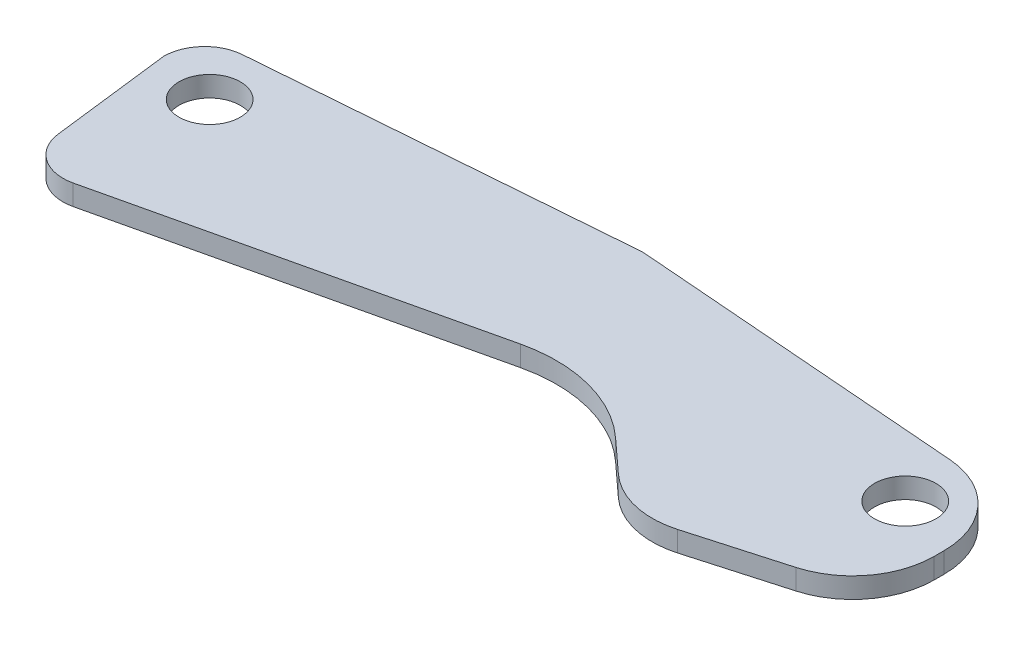
ISO-10303-21;
HEADER;
FILE_DESCRIPTION(('STEP AP214'),'2;1');
FILE_NAME('part.step','',(''),(''),'','','');
FILE_SCHEMA(('AUTOMOTIVE_DESIGN { 1 0 10303 214 1 1 1 1 }'));
ENDSEC;
DATA;
#1=APPLICATION_CONTEXT('core data for automotive mechanical design processes');
#2=APPLICATION_PROTOCOL_DEFINITION('international standard','automotive_design',2000,#1);
#3=PRODUCT_CONTEXT('',#1,'mechanical');
#4=PRODUCT('Part','Part','',(#3));
#5=PRODUCT_RELATED_PRODUCT_CATEGORY('part','',(#4));
#6=PRODUCT_DEFINITION_FORMATION('','',#4);
#7=PRODUCT_DEFINITION_CONTEXT('part definition',#1,'design');
#8=PRODUCT_DEFINITION('design','',#6,#7);
#9=PRODUCT_DEFINITION_SHAPE('','',#8);
#10=(LENGTH_UNIT() NAMED_UNIT(*) SI_UNIT(.MILLI.,.METRE.));
#11=(NAMED_UNIT(*) PLANE_ANGLE_UNIT() SI_UNIT($,.RADIAN.));
#12=(NAMED_UNIT(*) SI_UNIT($,.STERADIAN.) SOLID_ANGLE_UNIT());
#13=UNCERTAINTY_MEASURE_WITH_UNIT(LENGTH_MEASURE(1.E-05),#10,'distance_accuracy_value','');
#14=(GEOMETRIC_REPRESENTATION_CONTEXT(3) GLOBAL_UNCERTAINTY_ASSIGNED_CONTEXT((#13)) GLOBAL_UNIT_ASSIGNED_CONTEXT((#10,
#11,#12)) REPRESENTATION_CONTEXT('',''));
#15=CARTESIAN_POINT('',(0.,0.,0.));
#16=DIRECTION('',(0.,0.,1.));
#17=DIRECTION('',(1.,0.,0.));
#18=AXIS2_PLACEMENT_3D('',#15,#16,#17);
#19=CARTESIAN_POINT('',(0.,1.,0.));
#20=DIRECTION('',(0.,-1.,0.));
#21=DIRECTION('',(0.,0.,-1.));
#22=AXIS2_PLACEMENT_3D('',#19,#20,#21);
#23=PLANE('',#22);
#24=CARTESIAN_POINT('',(-17.04840786739,1.,-1.62405430046112));
#25=DIRECTION('',(0.,1.,0.));
#26=DIRECTION('',(0.,0.,1.));
#27=AXIS2_PLACEMENT_3D('',#24,#25,#26);
#28=CIRCLE('',#27,1.5);
#29=CARTESIAN_POINT('',(-17.04840786739,1.,-0.124054300461121));
#30=VERTEX_POINT('',#29);
#31=EDGE_CURVE('E247',#30,#30,#28,.T.);
#32=ORIENTED_EDGE('',*,*,#31,.F.);
#33=EDGE_LOOP('',(#32));
#34=FACE_BOUND('',#33,.T.);
#35=CARTESIAN_POINT('',(16.95159213261,1.,-1.62405430046112));
#36=DIRECTION('',(0.,1.,0.));
#37=DIRECTION('',(0.,0.,1.));
#38=AXIS2_PLACEMENT_3D('',#35,#36,#37);
#39=CIRCLE('',#38,1.50145326416188);
#40=CARTESIAN_POINT('',(16.95159213261,1.,-0.122601036299243));
#41=VERTEX_POINT('',#40);
#42=EDGE_CURVE('E489',#41,#41,#39,.T.);
#43=ORIENTED_EDGE('',*,*,#42,.F.);
#44=EDGE_LOOP('',(#43));
#45=FACE_BOUND('',#44,.T.);
#46=DIRECTION('',(0.961653618203562,0.,-0.274266874769809));
#47=VECTOR('',#46,1.);
#48=CARTESIAN_POINT('',(2.30223376436049,1.,8.07225236844889));
#49=LINE('',#48,#47);
#50=CARTESIAN_POINT('',(12.5934378050347,1.,5.13716605834188));
#51=VERTEX_POINT('',#50);
#52=CARTESIAN_POINT('',(17.0970674990792,1.,3.85271558893738));
#53=VERTEX_POINT('',#52);
#54=EDGE_CURVE('E235',#51,#53,#49,.T.);
#55=ORIENTED_EDGE('',*,*,#54,.T.);
#56=CARTESIAN_POINT('',(16.,1.,0.00610111612312902));
#57=DIRECTION('',(0.,-1.,0.));
#58=DIRECTION('',(0.,0.,-1.));
#59=AXIS2_PLACEMENT_3D('',#56,#57,#58);
#60=CIRCLE('',#59,4.);
#61=CARTESIAN_POINT('',(20.,1.,0.00610111612312902));
#62=VERTEX_POINT('',#61);
#63=EDGE_CURVE('E95',#53,#62,#60,.F.);
#64=ORIENTED_EDGE('',*,*,#63,.T.);
#65=DIRECTION('',(0.,0.,-1.));
#66=VECTOR('',#65,1.);
#67=CARTESIAN_POINT('',(20.,1.,5.75));
#68=LINE('',#67,#66);
#69=CARTESIAN_POINT('',(20.,1.,-0.479957640630012));
#70=VERTEX_POINT('',#69);
#71=EDGE_CURVE('E273',#62,#70,#68,.T.);
#72=ORIENTED_EDGE('',*,*,#71,.T.);
#73=CARTESIAN_POINT('',(16.,1.,-0.479957640630012));
#74=DIRECTION('',(0.,-1.,0.));
#75=DIRECTION('',(0.,0.,-1.));
#76=AXIS2_PLACEMENT_3D('',#73,#74,#75);
#77=CIRCLE('',#76,4.);
#78=CARTESIAN_POINT('',(16.313458923201,1.,-4.46765666431092));
#79=VERTEX_POINT('',#78);
#80=EDGE_CURVE('E288',#70,#79,#77,.F.);
#81=ORIENTED_EDGE('',*,*,#80,.T.);
#82=DIRECTION('',(0.996924755920226,0.,0.0783647308002611));
#83=VECTOR('',#82,1.);
#84=CARTESIAN_POINT('',(0.449211505723376,1.,-5.71468907155796));
#85=LINE('',#84,#83);
#86=CARTESIAN_POINT('',(0.156729461600511,1.,-5.73768005108323));
#87=VERTEX_POINT('',#86);
#88=EDGE_CURVE('E184',#87,#79,#85,.T.);
#89=ORIENTED_EDGE('',*,*,#88,.F.);
#90=CARTESIAN_POINT('',(0.,1.,-3.74383053924278));
#91=DIRECTION('',(0.,-1.,0.));
#92=DIRECTION('',(0.,0.,-1.));
#93=AXIS2_PLACEMENT_3D('',#90,#91,#92);
#94=CIRCLE('',#93,2.);
#95=CARTESIAN_POINT('',(-0.156729461600533,1.,-5.73768005108323));
#96=VERTEX_POINT('',#95);
#97=EDGE_CURVE('E279',#87,#96,#94,.F.);
#98=ORIENTED_EDGE('',*,*,#97,.T.);
#99=DIRECTION('',(-0.996924755920226,0.,0.0783647308002611));
#100=VECTOR('',#99,1.);
#101=CARTESIAN_POINT('',(-0.449211505723376,1.,-5.71468907155797));
#102=LINE('',#101,#100);
#103=CARTESIAN_POINT('',(-18.1567294616005,1.,-4.32276368349574));
#104=VERTEX_POINT('',#103);
#105=EDGE_CURVE('E265',#96,#104,#102,.T.);
#106=ORIENTED_EDGE('',*,*,#105,.T.);
#107=CARTESIAN_POINT('',(-18.,1.,-2.32891417165529));
#108=DIRECTION('',(0.,-1.,0.));
#109=DIRECTION('',(0.,0.,-1.));
#110=AXIS2_PLACEMENT_3D('',#107,#108,#109);
#111=CIRCLE('',#110,2.);
#112=CARTESIAN_POINT('',(-20.,1.,-2.32891417165529));
#113=VERTEX_POINT('',#112);
#114=EDGE_CURVE('E193',#104,#113,#111,.F.);
#115=ORIENTED_EDGE('',*,*,#114,.T.);
#116=DIRECTION('',(-0.120898963634585,0.,-0.992664817847436));
#117=VECTOR('',#116,1.);
#118=CARTESIAN_POINT('',(-20.,1.,-2.32891417165527));
#119=LINE('',#118,#117);
#120=CARTESIAN_POINT('',(-19.2851215731203,1.,3.5407363370657));
#121=VERTEX_POINT('',#120);
#122=EDGE_CURVE('E185',#121,#113,#119,.T.);
#123=ORIENTED_EDGE('',*,*,#122,.F.);
#124=CARTESIAN_POINT('',(-17.2997919374255,1.,3.29893840979653));
#125=DIRECTION('',(0.,-1.,0.));
#126=DIRECTION('',(0.,0.,-1.));
#127=AXIS2_PLACEMENT_3D('',#124,#125,#126);
#128=CIRCLE('',#127,2.);
#129=CARTESIAN_POINT('',(-16.8479918287672,1.,5.24723937777257));
#130=VERTEX_POINT('',#129);
#131=EDGE_CURVE('E201',#121,#130,#128,.F.);
#132=ORIENTED_EDGE('',*,*,#131,.T.);
#133=DIRECTION('',(0.974150483988019,0.,-0.225900054329141));
#134=VECTOR('',#133,1.);
#135=CARTESIAN_POINT('',(0.294943810343831,1.,1.27188838643253));
#136=LINE('',#135,#134);
#137=CARTESIAN_POINT('',(0.89910877577796,1.,1.13178590662202));
#138=VERTEX_POINT('',#137);
#139=EDGE_CURVE('E255',#130,#138,#136,.T.);
#140=ORIENTED_EDGE('',*,*,#139,.T.);
#141=CARTESIAN_POINT('',(2.48040915608195,1.,7.95083929453815));
#142=DIRECTION('',(0.,-1.,0.));
#143=DIRECTION('',(0.,0.,-1.));
#144=AXIS2_PLACEMENT_3D('',#141,#142,#143);
#145=CIRCLE('',#144,7.);
#146=CARTESIAN_POINT('',(7.20576337652104,1.,2.78643928181853));
#147=VERTEX_POINT('',#146);
#148=EDGE_CURVE('E214',#138,#147,#145,.T.);
#149=ORIENTED_EDGE('',*,*,#148,.T.);
#150=DIRECTION('',(0.737771430388518,0.,0.67505060291987));
#151=VECTOR('',#150,1.);
#152=CARTESIAN_POINT('',(1.89587935987788,1.,-2.07203077981282));
#153=LINE('',#152,#151);
#154=CARTESIAN_POINT('',(8.79616789427599,1.,4.2416373070817));
#155=VERTEX_POINT('',#154);
#156=EDGE_CURVE('E244',#147,#155,#153,.T.);
#157=ORIENTED_EDGE('',*,*,#156,.T.);
#158=CARTESIAN_POINT('',(11.4963703059555,1.,1.29055158552763));
#159=DIRECTION('',(0.,-1.,0.));
#160=DIRECTION('',(0.,0.,-1.));
#161=AXIS2_PLACEMENT_3D('',#158,#159,#160);
#162=CIRCLE('',#161,4.);
#163=EDGE_CURVE('E221',#155,#51,#162,.F.);
#164=ORIENTED_EDGE('',*,*,#163,.T.);
#165=EDGE_LOOP('',(#55,#64,#72,#81,#89,#98,#106,#115,#123,#132,#140,#149,#157,#164));
#166=FACE_BOUND('',#165,.T.);
#167=ADVANCED_FACE('F73',(#34,#45,#166),#23,.F.);
#168=CARTESIAN_POINT('',(0.,0.,0.));
#169=DIRECTION('',(0.,-1.,0.));
#170=DIRECTION('',(0.,0.,-1.));
#171=AXIS2_PLACEMENT_3D('',#168,#169,#170);
#172=PLANE('',#171);
#173=CARTESIAN_POINT('',(-17.04840786739,0.,-1.62405430046112));
#174=DIRECTION('',(0.,1.,0.));
#175=DIRECTION('',(0.,0.,1.));
#176=AXIS2_PLACEMENT_3D('',#173,#174,#175);
#177=CIRCLE('',#176,1.5);
#178=CARTESIAN_POINT('',(-17.04840786739,0.,-0.124054300461121));
#179=VERTEX_POINT('',#178);
#180=EDGE_CURVE('E242',#179,#179,#177,.T.);
#181=ORIENTED_EDGE('',*,*,#180,.T.);
#182=EDGE_LOOP('',(#181));
#183=FACE_BOUND('',#182,.T.);
#184=CARTESIAN_POINT('',(16.95159213261,0.,-1.62405430046112));
#185=DIRECTION('',(0.,1.,0.));
#186=DIRECTION('',(0.,0.,1.));
#187=AXIS2_PLACEMENT_3D('',#184,#185,#186);
#188=CIRCLE('',#187,1.50145326416188);
#189=CARTESIAN_POINT('',(16.95159213261,0.,-0.122601036299243));
#190=VERTEX_POINT('',#189);
#191=EDGE_CURVE('E486',#190,#190,#188,.T.);
#192=ORIENTED_EDGE('',*,*,#191,.T.);
#193=EDGE_LOOP('',(#192));
#194=FACE_BOUND('',#193,.T.);
#195=DIRECTION('',(0.,0.,-1.));
#196=VECTOR('',#195,1.);
#197=CARTESIAN_POINT('',(20.,0.,5.75));
#198=LINE('',#197,#196);
#199=CARTESIAN_POINT('',(20.,0.,0.00610111612312902));
#200=VERTEX_POINT('',#199);
#201=CARTESIAN_POINT('',(20.,0.,-0.479957640630012));
#202=VERTEX_POINT('',#201);
#203=EDGE_CURVE('E270',#200,#202,#198,.T.);
#204=ORIENTED_EDGE('',*,*,#203,.F.);
#205=CARTESIAN_POINT('',(16.,0.,0.00610111612312902));
#206=DIRECTION('',(0.,-1.,0.));
#207=DIRECTION('',(0.,0.,-1.));
#208=AXIS2_PLACEMENT_3D('',#205,#206,#207);
#209=CIRCLE('',#208,4.);
#210=CARTESIAN_POINT('',(17.0970674990792,0.,3.85271558893738));
#211=VERTEX_POINT('',#210);
#212=EDGE_CURVE('E12',#200,#211,#209,.T.);
#213=ORIENTED_EDGE('',*,*,#212,.T.);
#214=DIRECTION('',(0.961653618203562,0.,-0.274266874769809));
#215=VECTOR('',#214,1.);
#216=CARTESIAN_POINT('',(2.30223376436049,0.,8.07225236844889));
#217=LINE('',#216,#215);
#218=CARTESIAN_POINT('',(12.5934378050347,0.,5.13716605834188));
#219=VERTEX_POINT('',#218);
#220=EDGE_CURVE('E238',#219,#211,#217,.T.);
#221=ORIENTED_EDGE('',*,*,#220,.F.);
#222=CARTESIAN_POINT('',(11.4963703059555,0.,1.29055158552763));
#223=DIRECTION('',(0.,-1.,0.));
#224=DIRECTION('',(0.,0.,-1.));
#225=AXIS2_PLACEMENT_3D('',#222,#223,#224);
#226=CIRCLE('',#225,4.);
#227=CARTESIAN_POINT('',(8.79616789427599,0.,4.2416373070817));
#228=VERTEX_POINT('',#227);
#229=EDGE_CURVE('E225',#219,#228,#226,.T.);
#230=ORIENTED_EDGE('',*,*,#229,.T.);
#231=DIRECTION('',(0.737771430388518,0.,0.67505060291987));
#232=VECTOR('',#231,1.);
#233=CARTESIAN_POINT('',(1.89587935987788,0.,-2.07203077981282));
#234=LINE('',#233,#232);
#235=CARTESIAN_POINT('',(7.20576337652104,0.,2.78643928181853));
#236=VERTEX_POINT('',#235);
#237=EDGE_CURVE('E251',#236,#228,#234,.T.);
#238=ORIENTED_EDGE('',*,*,#237,.F.);
#239=CARTESIAN_POINT('',(2.48040915608195,0.,7.95083929453815));
#240=DIRECTION('',(0.,-1.,0.));
#241=DIRECTION('',(0.,0.,-1.));
#242=AXIS2_PLACEMENT_3D('',#239,#240,#241);
#243=CIRCLE('',#242,7.);
#244=CARTESIAN_POINT('',(0.89910877577796,0.,1.13178590662202));
#245=VERTEX_POINT('',#244);
#246=EDGE_CURVE('E216',#236,#245,#243,.F.);
#247=ORIENTED_EDGE('',*,*,#246,.T.);
#248=DIRECTION('',(0.974150483988019,0.,-0.225900054329141));
#249=VECTOR('',#248,1.);
#250=CARTESIAN_POINT('',(0.294943810343831,0.,1.27188838643253));
#251=LINE('',#250,#249);
#252=CARTESIAN_POINT('',(-16.8479918287672,0.,5.24723937777257));
#253=VERTEX_POINT('',#252);
#254=EDGE_CURVE('E254',#253,#245,#251,.T.);
#255=ORIENTED_EDGE('',*,*,#254,.F.);
#256=CARTESIAN_POINT('',(-17.2997919374255,0.,3.29893840979653));
#257=DIRECTION('',(0.,-1.,0.));
#258=DIRECTION('',(0.,0.,-1.));
#259=AXIS2_PLACEMENT_3D('',#256,#257,#258);
#260=CIRCLE('',#259,2.);
#261=CARTESIAN_POINT('',(-19.2851215731203,0.,3.5407363370657));
#262=VERTEX_POINT('',#261);
#263=EDGE_CURVE('E180',#253,#262,#260,.T.);
#264=ORIENTED_EDGE('',*,*,#263,.T.);
#265=DIRECTION('',(-0.120898963634585,0.,-0.992664817847436));
#266=VECTOR('',#265,1.);
#267=CARTESIAN_POINT('',(-20.,0.,-2.32891417165527));
#268=LINE('',#267,#266);
#269=CARTESIAN_POINT('',(-20.,0.,-2.32891417165527));
#270=VERTEX_POINT('',#269);
#271=EDGE_CURVE('E171',#262,#270,#268,.T.);
#272=ORIENTED_EDGE('',*,*,#271,.T.);
#273=CARTESIAN_POINT('',(-18.,0.,-2.32891417165529));
#274=DIRECTION('',(0.,-1.,0.));
#275=DIRECTION('',(0.,0.,-1.));
#276=AXIS2_PLACEMENT_3D('',#273,#274,#275);
#277=CIRCLE('',#276,2.);
#278=CARTESIAN_POINT('',(-18.1567294616005,0.,-4.32276368349574));
#279=VERTEX_POINT('',#278);
#280=EDGE_CURVE('E176',#270,#279,#277,.T.);
#281=ORIENTED_EDGE('',*,*,#280,.T.);
#282=DIRECTION('',(-0.996924755920226,0.,0.0783647308002611));
#283=VECTOR('',#282,1.);
#284=CARTESIAN_POINT('',(-0.449211505723376,0.,-5.71468907155797));
#285=LINE('',#284,#283);
#286=CARTESIAN_POINT('',(-0.156729461600533,0.,-5.73768005108323));
#287=VERTEX_POINT('',#286);
#288=EDGE_CURVE('E268',#287,#279,#285,.T.);
#289=ORIENTED_EDGE('',*,*,#288,.F.);
#290=CARTESIAN_POINT('',(0.,0.,-3.74383053924278));
#291=DIRECTION('',(0.,-1.,0.));
#292=DIRECTION('',(0.,0.,-1.));
#293=AXIS2_PLACEMENT_3D('',#290,#291,#292);
#294=CIRCLE('',#293,2.);
#295=CARTESIAN_POINT('',(0.156729461600511,0.,-5.73768005108323));
#296=VERTEX_POINT('',#295);
#297=EDGE_CURVE('E283',#287,#296,#294,.T.);
#298=ORIENTED_EDGE('',*,*,#297,.T.);
#299=DIRECTION('',(0.996924755920226,0.,0.0783647308002611));
#300=VECTOR('',#299,1.);
#301=CARTESIAN_POINT('',(0.449211505723376,0.,-5.71468907155796));
#302=LINE('',#301,#300);
#303=CARTESIAN_POINT('',(16.313458923201,0.,-4.46765666431092));
#304=VERTEX_POINT('',#303);
#305=EDGE_CURVE('E262',#296,#304,#302,.T.);
#306=ORIENTED_EDGE('',*,*,#305,.T.);
#307=CARTESIAN_POINT('',(16.,0.,-0.479957640630012));
#308=DIRECTION('',(0.,-1.,0.));
#309=DIRECTION('',(0.,0.,-1.));
#310=AXIS2_PLACEMENT_3D('',#307,#308,#309);
#311=CIRCLE('',#310,4.);
#312=EDGE_CURVE('E292',#304,#202,#311,.T.);
#313=ORIENTED_EDGE('',*,*,#312,.T.);
#314=EDGE_LOOP('',(#204,#213,#221,#230,#238,#247,#255,#264,#272,#281,#289,#298,#306,#313));
#315=FACE_BOUND('',#314,.T.);
#316=ADVANCED_FACE('F173',(#183,#194,#315),#172,.T.);
#317=CARTESIAN_POINT('',(20.,1.,5.75));
#318=DIRECTION('',(-1.,0.,0.));
#319=DIRECTION('',(0.,0.,1.));
#320=AXIS2_PLACEMENT_3D('',#317,#318,#319);
#321=PLANE('',#320);
#322=ORIENTED_EDGE('',*,*,#71,.F.);
#323=DIRECTION('',(0.,1.,0.));
#324=VECTOR('',#323,1.);
#325=CARTESIAN_POINT('',(20.,0.,0.00610111612312902));
#326=LINE('',#325,#324);
#327=EDGE_CURVE('E81',#62,#200,#326,.F.);
#328=ORIENTED_EDGE('',*,*,#327,.T.);
#329=ORIENTED_EDGE('',*,*,#203,.T.);
#330=DIRECTION('',(0.,1.,0.));
#331=VECTOR('',#330,1.);
#332=CARTESIAN_POINT('',(20.,1.,-0.479957640630012));
#333=LINE('',#332,#331);
#334=EDGE_CURVE('E285',#202,#70,#333,.T.);
#335=ORIENTED_EDGE('',*,*,#334,.T.);
#336=EDGE_LOOP('',(#322,#328,#329,#335));
#337=FACE_BOUND('',#336,.T.);
#338=ADVANCED_FACE('F313',(#337),#321,.F.);
#339=CARTESIAN_POINT('',(-0.449211505723376,0.,-5.71468907155797));
#340=DIRECTION('',(-0.0783647308002611,0.,-0.996924755920226));
#341=DIRECTION('',(-0.996924755920226,0.,0.0783647308002611));
#342=AXIS2_PLACEMENT_3D('',#339,#340,#341);
#343=PLANE('',#342);
#344=ORIENTED_EDGE('',*,*,#288,.T.);
#345=DIRECTION('',(0.,1.,0.));
#346=VECTOR('',#345,1.);
#347=CARTESIAN_POINT('',(-18.1567294616005,1.,-4.32276368349574));
#348=LINE('',#347,#346);
#349=EDGE_CURVE('E198',#279,#104,#348,.T.);
#350=ORIENTED_EDGE('',*,*,#349,.T.);
#351=ORIENTED_EDGE('',*,*,#105,.F.);
#352=DIRECTION('',(0.,1.,0.));
#353=VECTOR('',#352,1.);
#354=CARTESIAN_POINT('',(-0.156729461600533,0.,-5.73768005108323));
#355=LINE('',#354,#353);
#356=EDGE_CURVE('E281',#96,#287,#355,.F.);
#357=ORIENTED_EDGE('',*,*,#356,.T.);
#358=EDGE_LOOP('',(#344,#350,#351,#357));
#359=FACE_BOUND('',#358,.T.);
#360=ADVANCED_FACE('F297',(#359),#343,.T.);
#361=CARTESIAN_POINT('',(0.449211505723376,0.,-5.71468907155796));
#362=DIRECTION('',(-0.0783647308002611,0.,0.996924755920226));
#363=DIRECTION('',(0.996924755920226,0.,0.0783647308002611));
#364=AXIS2_PLACEMENT_3D('',#361,#362,#363);
#365=PLANE('',#364);
#366=ORIENTED_EDGE('',*,*,#88,.T.);
#367=DIRECTION('',(0.,1.,0.));
#368=VECTOR('',#367,1.);
#369=CARTESIAN_POINT('',(16.313458923201,0.,-4.46765666431092));
#370=LINE('',#369,#368);
#371=EDGE_CURVE('E290',#79,#304,#370,.F.);
#372=ORIENTED_EDGE('',*,*,#371,.T.);
#373=ORIENTED_EDGE('',*,*,#305,.F.);
#374=DIRECTION('',(0.,1.,0.));
#375=VECTOR('',#374,1.);
#376=CARTESIAN_POINT('',(0.156729461600511,1.,-5.73768005108323));
#377=LINE('',#376,#375);
#378=EDGE_CURVE('E275',#296,#87,#377,.T.);
#379=ORIENTED_EDGE('',*,*,#378,.T.);
#380=EDGE_LOOP('',(#366,#372,#373,#379));
#381=FACE_BOUND('',#380,.T.);
#382=ADVANCED_FACE('F306',(#381),#365,.F.);
#383=CARTESIAN_POINT('',(0.,0.,-3.74383053924278));
#384=DIRECTION('',(0.,-1.,0.));
#385=DIRECTION('',(0.,0.,-1.));
#386=AXIS2_PLACEMENT_3D('',#383,#384,#385);
#387=CYLINDRICAL_SURFACE('',#386,2.);
#388=ORIENTED_EDGE('',*,*,#297,.F.);
#389=ORIENTED_EDGE('',*,*,#356,.F.);
#390=ORIENTED_EDGE('',*,*,#97,.F.);
#391=ORIENTED_EDGE('',*,*,#378,.F.);
#392=EDGE_LOOP('',(#388,#389,#390,#391));
#393=FACE_BOUND('',#392,.T.);
#394=ADVANCED_FACE('F303',(#393),#387,.T.);
#395=CARTESIAN_POINT('',(16.,1.,-0.479957640630012));
#396=DIRECTION('',(0.,1.,0.));
#397=DIRECTION('',(0.,0.,1.));
#398=AXIS2_PLACEMENT_3D('',#395,#396,#397);
#399=CYLINDRICAL_SURFACE('',#398,4.);
#400=ORIENTED_EDGE('',*,*,#312,.F.);
#401=ORIENTED_EDGE('',*,*,#371,.F.);
#402=ORIENTED_EDGE('',*,*,#80,.F.);
#403=ORIENTED_EDGE('',*,*,#334,.F.);
#404=EDGE_LOOP('',(#400,#401,#402,#403));
#405=FACE_BOUND('',#404,.T.);
#406=ADVANCED_FACE('F312',(#405),#399,.T.);
#407=CARTESIAN_POINT('',(-18.,0.,-2.32891417165529));
#408=DIRECTION('',(0.,-1.,0.));
#409=DIRECTION('',(0.,0.,-1.));
#410=AXIS2_PLACEMENT_3D('',#407,#408,#409);
#411=CYLINDRICAL_SURFACE('',#410,2.);
#412=ORIENTED_EDGE('',*,*,#280,.F.);
#413=DIRECTION('',(0.,1.,0.));
#414=VECTOR('',#413,1.);
#415=CARTESIAN_POINT('',(-20.,0.,-2.32891417165529));
#416=LINE('',#415,#414);
#417=EDGE_CURVE('E188',#113,#270,#416,.F.);
#418=ORIENTED_EDGE('',*,*,#417,.F.);
#419=ORIENTED_EDGE('',*,*,#114,.F.);
#420=ORIENTED_EDGE('',*,*,#349,.F.);
#421=EDGE_LOOP('',(#412,#418,#419,#420));
#422=FACE_BOUND('',#421,.T.);
#423=ADVANCED_FACE('F196',(#422),#411,.T.);
#424=CARTESIAN_POINT('',(-20.,0.,-2.32891417165527));
#425=DIRECTION('',(0.992664817847436,0.,-0.120898963634585));
#426=DIRECTION('',(-0.120898963634585,0.,-0.992664817847436));
#427=AXIS2_PLACEMENT_3D('',#424,#425,#426);
#428=PLANE('',#427);
#429=ORIENTED_EDGE('',*,*,#271,.F.);
#430=DIRECTION('',(0.,1.,0.));
#431=VECTOR('',#430,1.);
#432=CARTESIAN_POINT('',(-19.2851215731203,1.,3.5407363370657));
#433=LINE('',#432,#431);
#434=EDGE_CURVE('E199',#262,#121,#433,.T.);
#435=ORIENTED_EDGE('',*,*,#434,.T.);
#436=ORIENTED_EDGE('',*,*,#122,.T.);
#437=ORIENTED_EDGE('',*,*,#417,.T.);
#438=EDGE_LOOP('',(#429,#435,#436,#437));
#439=FACE_BOUND('',#438,.T.);
#440=ADVANCED_FACE('F189',(#439),#428,.F.);
#441=CARTESIAN_POINT('',(1.89587935987788,0.,-2.07203077981282));
#442=DIRECTION('',(-0.67505060291987,0.,0.737771430388518));
#443=DIRECTION('',(0.737771430388518,0.,0.67505060291987));
#444=AXIS2_PLACEMENT_3D('',#441,#442,#443);
#445=PLANE('',#444);
#446=ORIENTED_EDGE('',*,*,#237,.T.);
#447=DIRECTION('',(0.,1.,0.));
#448=VECTOR('',#447,1.);
#449=CARTESIAN_POINT('',(8.79616789427599,0.,4.2416373070817));
#450=LINE('',#449,#448);
#451=EDGE_CURVE('E218',#228,#155,#450,.T.);
#452=ORIENTED_EDGE('',*,*,#451,.T.);
#453=ORIENTED_EDGE('',*,*,#156,.F.);
#454=DIRECTION('',(0.,1.,0.));
#455=VECTOR('',#454,1.);
#456=CARTESIAN_POINT('',(7.20576337652104,0.,2.78643928181852));
#457=LINE('',#456,#455);
#458=EDGE_CURVE('E212',#147,#236,#457,.F.);
#459=ORIENTED_EDGE('',*,*,#458,.T.);
#460=EDGE_LOOP('',(#446,#452,#453,#459));
#461=FACE_BOUND('',#460,.T.);
#462=ADVANCED_FACE('F365',(#461),#445,.T.);
#463=CARTESIAN_POINT('',(0.294943810343831,0.,1.27188838643253));
#464=DIRECTION('',(0.225900054329141,0.,0.974150483988019));
#465=DIRECTION('',(0.974150483988019,0.,-0.225900054329141));
#466=AXIS2_PLACEMENT_3D('',#463,#464,#465);
#467=PLANE('',#466);
#468=ORIENTED_EDGE('',*,*,#254,.T.);
#469=DIRECTION('',(0.,1.,0.));
#470=VECTOR('',#469,1.);
#471=CARTESIAN_POINT('',(0.89910877577796,1.,1.13178590662202));
#472=LINE('',#471,#470);
#473=EDGE_CURVE('E209',#245,#138,#472,.T.);
#474=ORIENTED_EDGE('',*,*,#473,.T.);
#475=ORIENTED_EDGE('',*,*,#139,.F.);
#476=DIRECTION('',(0.,1.,0.));
#477=VECTOR('',#476,1.);
#478=CARTESIAN_POINT('',(-16.8479918287672,0.,5.24723937777257));
#479=LINE('',#478,#477);
#480=EDGE_CURVE('E206',#130,#253,#479,.F.);
#481=ORIENTED_EDGE('',*,*,#480,.T.);
#482=EDGE_LOOP('',(#468,#474,#475,#481));
#483=FACE_BOUND('',#482,.T.);
#484=ADVANCED_FACE('F360',(#483),#467,.T.);
#485=CARTESIAN_POINT('',(2.30223376436049,0.,8.07225236844889));
#486=DIRECTION('',(0.274266874769809,0.,0.961653618203562));
#487=DIRECTION('',(0.961653618203562,0.,-0.274266874769809));
#488=AXIS2_PLACEMENT_3D('',#485,#486,#487);
#489=PLANE('',#488);
#490=ORIENTED_EDGE('',*,*,#220,.T.);
#491=DIRECTION('',(0.,1.,0.));
#492=VECTOR('',#491,1.);
#493=CARTESIAN_POINT('',(17.0970674990792,1.,3.85271558893738));
#494=LINE('',#493,#492);
#495=EDGE_CURVE('E227',#211,#53,#494,.T.);
#496=ORIENTED_EDGE('',*,*,#495,.T.);
#497=ORIENTED_EDGE('',*,*,#54,.F.);
#498=DIRECTION('',(0.,1.,0.));
#499=VECTOR('',#498,1.);
#500=CARTESIAN_POINT('',(12.5934378050347,0.,5.13716605834188));
#501=LINE('',#500,#499);
#502=EDGE_CURVE('E223',#51,#219,#501,.F.);
#503=ORIENTED_EDGE('',*,*,#502,.T.);
#504=EDGE_LOOP('',(#490,#496,#497,#503));
#505=FACE_BOUND('',#504,.T.);
#506=ADVANCED_FACE('F234',(#505),#489,.T.);
#507=CARTESIAN_POINT('',(-17.2997919374255,0.,3.29893840979653));
#508=DIRECTION('',(0.,-1.,0.));
#509=DIRECTION('',(0.,0.,-1.));
#510=AXIS2_PLACEMENT_3D('',#507,#508,#509);
#511=CYLINDRICAL_SURFACE('',#510,2.);
#512=ORIENTED_EDGE('',*,*,#263,.F.);
#513=ORIENTED_EDGE('',*,*,#480,.F.);
#514=ORIENTED_EDGE('',*,*,#131,.F.);
#515=ORIENTED_EDGE('',*,*,#434,.F.);
#516=EDGE_LOOP('',(#512,#513,#514,#515));
#517=FACE_BOUND('',#516,.T.);
#518=ADVANCED_FACE('F347',(#517),#511,.T.);
#519=CARTESIAN_POINT('',(2.48040915608195,0.,7.95083929453815));
#520=DIRECTION('',(0.,-1.,0.));
#521=DIRECTION('',(0.,0.,-1.));
#522=AXIS2_PLACEMENT_3D('',#519,#520,#521);
#523=CYLINDRICAL_SURFACE('',#522,7.);
#524=ORIENTED_EDGE('',*,*,#246,.F.);
#525=ORIENTED_EDGE('',*,*,#458,.F.);
#526=ORIENTED_EDGE('',*,*,#148,.F.);
#527=ORIENTED_EDGE('',*,*,#473,.F.);
#528=EDGE_LOOP('',(#524,#525,#526,#527));
#529=FACE_BOUND('',#528,.T.);
#530=ADVANCED_FACE('F324',(#529),#523,.F.);
#531=CARTESIAN_POINT('',(11.4963703059555,0.,1.29055158552763));
#532=DIRECTION('',(0.,1.,0.));
#533=DIRECTION('',(0.,0.,1.));
#534=AXIS2_PLACEMENT_3D('',#531,#532,#533);
#535=CYLINDRICAL_SURFACE('',#534,4.);
#536=ORIENTED_EDGE('',*,*,#229,.F.);
#537=ORIENTED_EDGE('',*,*,#502,.F.);
#538=ORIENTED_EDGE('',*,*,#163,.F.);
#539=ORIENTED_EDGE('',*,*,#451,.F.);
#540=EDGE_LOOP('',(#536,#537,#538,#539));
#541=FACE_BOUND('',#540,.T.);
#542=ADVANCED_FACE('F316',(#541),#535,.T.);
#543=CARTESIAN_POINT('',(16.,0.,0.00610111612312902));
#544=DIRECTION('',(0.,-1.,0.));
#545=DIRECTION('',(0.,0.,-1.));
#546=AXIS2_PLACEMENT_3D('',#543,#544,#545);
#547=CYLINDRICAL_SURFACE('',#546,4.);
#548=ORIENTED_EDGE('',*,*,#212,.F.);
#549=ORIENTED_EDGE('',*,*,#327,.F.);
#550=ORIENTED_EDGE('',*,*,#63,.F.);
#551=ORIENTED_EDGE('',*,*,#495,.F.);
#552=EDGE_LOOP('',(#548,#549,#550,#551));
#553=FACE_BOUND('',#552,.T.);
#554=ADVANCED_FACE('F75',(#553),#547,.T.);
#555=CARTESIAN_POINT('',(16.95159213261,0.,-1.62405430046112));
#556=DIRECTION('',(0.,1.,0.));
#557=DIRECTION('',(0.,0.,1.));
#558=AXIS2_PLACEMENT_3D('',#555,#556,#557);
#559=CYLINDRICAL_SURFACE('',#558,1.50145326416188);
#560=ORIENTED_EDGE('',*,*,#191,.F.);
#561=EDGE_LOOP('',(#560));
#562=FACE_BOUND('',#561,.T.);
#563=ORIENTED_EDGE('',*,*,#42,.T.);
#564=EDGE_LOOP('',(#563));
#565=FACE_BOUND('',#564,.T.);
#566=ADVANCED_FACE('F315',(#562,#565),#559,.F.);
#567=CARTESIAN_POINT('',(-17.04840786739,0.,-1.62405430046112));
#568=DIRECTION('',(0.,1.,0.));
#569=DIRECTION('',(0.,0.,1.));
#570=AXIS2_PLACEMENT_3D('',#567,#568,#569);
#571=CYLINDRICAL_SURFACE('',#570,1.5);
#572=ORIENTED_EDGE('',*,*,#180,.F.);
#573=EDGE_LOOP('',(#572));
#574=FACE_BOUND('',#573,.T.);
#575=ORIENTED_EDGE('',*,*,#31,.T.);
#576=EDGE_LOOP('',(#575));
#577=FACE_BOUND('',#576,.T.);
#578=ADVANCED_FACE('F321',(#574,#577),#571,.F.);
#579=CLOSED_SHELL('',(#167,#316,#338,#360,#382,#394,#406,#423,#440,#462,#484,#506,#518,#530,
#542,#554,#566,#578));
#580=MANIFOLD_SOLID_BREP('B2',#579);
#581=ADVANCED_BREP_SHAPE_REPRESENTATION('',(#18,#580),#14);
#582=SHAPE_DEFINITION_REPRESENTATION(#9,#581);
ENDSEC;
END-ISO-10303-21;
